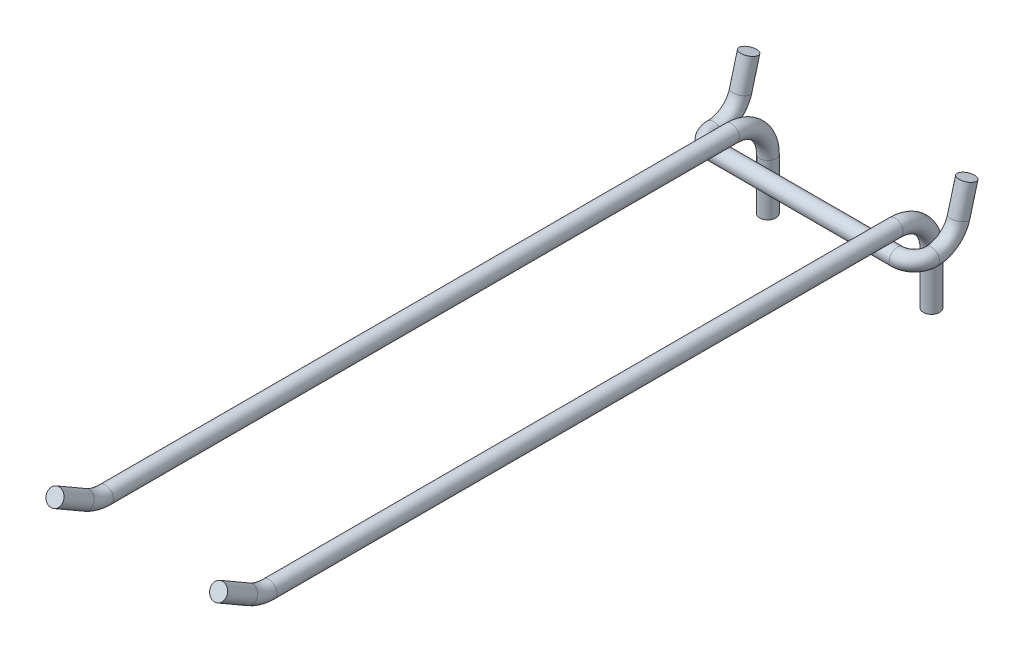
ISO-10303-21;
HEADER;
FILE_DESCRIPTION(('STEP AP214'),'2;1');
FILE_NAME('part.step','',(''),(''),'','','');
FILE_SCHEMA(('AUTOMOTIVE_DESIGN { 1 0 10303 214 1 1 1 1 }'));
ENDSEC;
DATA;
#1=APPLICATION_CONTEXT('core data for automotive mechanical design processes');
#2=APPLICATION_PROTOCOL_DEFINITION('international standard','automotive_design',2000,#1);
#3=PRODUCT_CONTEXT('',#1,'mechanical');
#4=PRODUCT('Part','Part','',(#3));
#5=PRODUCT_RELATED_PRODUCT_CATEGORY('part','',(#4));
#6=PRODUCT_DEFINITION_FORMATION('','',#4);
#7=PRODUCT_DEFINITION_CONTEXT('part definition',#1,'design');
#8=PRODUCT_DEFINITION('design','',#6,#7);
#9=PRODUCT_DEFINITION_SHAPE('','',#8);
#10=(LENGTH_UNIT() NAMED_UNIT(*) SI_UNIT(.MILLI.,.METRE.));
#11=(NAMED_UNIT(*) PLANE_ANGLE_UNIT() SI_UNIT($,.RADIAN.));
#12=(NAMED_UNIT(*) SI_UNIT($,.STERADIAN.) SOLID_ANGLE_UNIT());
#13=UNCERTAINTY_MEASURE_WITH_UNIT(LENGTH_MEASURE(1.E-05),#10,'distance_accuracy_value','');
#14=(GEOMETRIC_REPRESENTATION_CONTEXT(3) GLOBAL_UNCERTAINTY_ASSIGNED_CONTEXT((#13)) GLOBAL_UNIT_ASSIGNED_CONTEXT((#10,
#11,#12)) REPRESENTATION_CONTEXT('',''));
#15=CARTESIAN_POINT('',(0.,0.,0.));
#16=DIRECTION('',(0.,0.,1.));
#17=DIRECTION('',(1.,0.,0.));
#18=AXIS2_PLACEMENT_3D('',#15,#16,#17);
#19=CARTESIAN_POINT('',(19.05,-18.57375,-81.3689));
#20=DIRECTION('',(0.,-1.,0.));
#21=DIRECTION('',(0.,0.,-1.));
#22=AXIS2_PLACEMENT_3D('',#19,#20,#21);
#23=PLANE('',#22);
#24=CARTESIAN_POINT('',(19.05,-18.57375,-81.3689));
#25=DIRECTION('',(0.,1.,0.));
#26=DIRECTION('',(0.,0.,-1.));
#27=AXIS2_PLACEMENT_3D('',#24,#25,#26);
#28=CIRCLE('',#27,1.8796);
#29=CARTESIAN_POINT('',(19.05,-18.57375,-83.2485));
#30=VERTEX_POINT('',#29);
#31=EDGE_CURVE('E77',#30,#30,#28,.T.);
#32=ORIENTED_EDGE('',*,*,#31,.F.);
#33=EDGE_LOOP('',(#32));
#34=FACE_BOUND('',#33,.T.);
#35=ADVANCED_FACE('F65',(#34),#23,.T.);
#36=CARTESIAN_POINT('',(19.05,7.19976140133623,84.6709));
#37=DIRECTION('',(0.,-0.499999999999993,-0.866025403784443));
#38=DIRECTION('',(0.,0.866025403784443,-0.499999999999993));
#39=AXIS2_PLACEMENT_3D('',#36,#37,#38);
#40=PLANE('',#39);
#41=CARTESIAN_POINT('',(19.05,7.19976140133623,84.6709));
#42=DIRECTION('',(0.,0.499999999999993,0.866025403784443));
#43=DIRECTION('',(0.,0.866025403784443,-0.499999999999993));
#44=AXIS2_PLACEMENT_3D('',#41,#42,#43);
#45=CIRCLE('',#44,1.8796);
#46=CARTESIAN_POINT('',(19.05,8.82754275028947,83.7311));
#47=VERTEX_POINT('',#46);
#48=EDGE_CURVE('E13',#47,#47,#45,.T.);
#49=ORIENTED_EDGE('',*,*,#48,.T.);
#50=EDGE_LOOP('',(#49));
#51=FACE_BOUND('',#50,.T.);
#52=ADVANCED_FACE('F80',(#51),#40,.F.);
#53=CARTESIAN_POINT('',(19.05,-18.57375,-81.3689));
#54=DIRECTION('',(0.,1.,0.));
#55=DIRECTION('',(0.,0.,1.));
#56=AXIS2_PLACEMENT_3D('',#53,#54,#55);
#57=CYLINDRICAL_SURFACE('',#56,1.8796);
#58=CARTESIAN_POINT('',(19.05,-6.5786,-81.3689));
#59=DIRECTION('',(0.,1.,0.));
#60=DIRECTION('',(0.,0.,-1.));
#61=AXIS2_PLACEMENT_3D('',#58,#59,#60);
#62=CIRCLE('',#61,1.8796);
#63=CARTESIAN_POINT('',(19.05,-6.5786,-83.2485));
#64=VERTEX_POINT('',#63);
#65=EDGE_CURVE('E97',#64,#64,#62,.T.);
#66=ORIENTED_EDGE('',*,*,#65,.F.);
#67=EDGE_LOOP('',(#66));
#68=FACE_BOUND('',#67,.T.);
#69=ORIENTED_EDGE('',*,*,#31,.T.);
#70=EDGE_LOOP('',(#69));
#71=FACE_BOUND('',#70,.T.);
#72=ADVANCED_FACE('F104',(#68,#71),#57,.T.);
#73=CARTESIAN_POINT('',(19.05,-6.5786,-72.9107));
#74=DIRECTION('',(-1.,0.,0.));
#75=DIRECTION('',(0.,0.,-1.));
#76=AXIS2_PLACEMENT_3D('',#73,#74,#75);
#77=TOROIDAL_SURFACE('',#76,8.45819999999999,1.8796);
#78=CARTESIAN_POINT('',(19.05,1.87960000000001,-72.9107));
#79=DIRECTION('',(0.,0.,1.));
#80=DIRECTION('',(0.,1.,0.));
#81=AXIS2_PLACEMENT_3D('',#78,#79,#80);
#82=CIRCLE('',#81,1.8796);
#83=CARTESIAN_POINT('',(19.05,3.75919999999999,-72.9107));
#84=VERTEX_POINT('',#83);
#85=EDGE_CURVE('E92',#84,#84,#82,.T.);
#86=CARTESIAN_POINT('',(19.05,-6.5786,-72.9107));
#87=DIRECTION('',(-1.,0.,0.));
#88=DIRECTION('',(0.,0.,-1.));
#89=AXIS2_PLACEMENT_3D('',#86,#87,#88);
#90=CIRCLE('',#89,10.3378);
#91=EDGE_CURVE('',#84,#64,#90,.T.);
#92=ORIENTED_EDGE('',*,*,#85,.F.);
#93=ORIENTED_EDGE('',*,*,#65,.T.);
#94=ORIENTED_EDGE('',*,*,#91,.T.);
#95=ORIENTED_EDGE('',*,*,#91,.F.);
#96=EDGE_LOOP('',(#92,#94,#93,#95));
#97=FACE_BOUND('',#96,.T.);
#98=ADVANCED_FACE('F102',(#97),#77,.T.);
#99=CARTESIAN_POINT('',(19.05,1.87960000000001,-72.9107));
#100=DIRECTION('',(0.,0.,1.));
#101=DIRECTION('',(0.,-1.,0.));
#102=AXIS2_PLACEMENT_3D('',#99,#100,#101);
#103=CYLINDRICAL_SURFACE('',#102,1.8796);
#104=CARTESIAN_POINT('',(19.05,1.8796,72.9107));
#105=DIRECTION('',(0.,0.,1.));
#106=DIRECTION('',(0.,1.,0.));
#107=AXIS2_PLACEMENT_3D('',#104,#105,#106);
#108=CIRCLE('',#107,1.8796);
#109=CARTESIAN_POINT('',(19.05,0.,72.9107));
#110=VERTEX_POINT('',#109);
#111=EDGE_CURVE('E90',#110,#110,#108,.T.);
#112=ORIENTED_EDGE('',*,*,#111,.F.);
#113=EDGE_LOOP('',(#112));
#114=FACE_BOUND('',#113,.T.);
#115=ORIENTED_EDGE('',*,*,#85,.T.);
#116=EDGE_LOOP('',(#115));
#117=FACE_BOUND('',#116,.T.);
#118=ADVANCED_FACE('F111',(#114,#117),#103,.T.);
#119=CARTESIAN_POINT('',(19.05,11.3792,72.9107));
#120=DIRECTION('',(1.,0.,0.));
#121=DIRECTION('',(0.,0.,1.));
#122=AXIS2_PLACEMENT_3D('',#119,#120,#121);
#123=TOROIDAL_SURFACE('',#122,9.4996,1.8796);
#124=CARTESIAN_POINT('',(19.05,3.15230507420931,77.6605));
#125=DIRECTION('',(0.,0.499999999999994,0.866025403784442));
#126=DIRECTION('',(0.,0.866025403784442,-0.499999999999994));
#127=AXIS2_PLACEMENT_3D('',#124,#125,#126);
#128=CIRCLE('',#127,1.8796);
#129=CARTESIAN_POINT('',(19.05,1.52452372525607,78.6002999999999));
#130=VERTEX_POINT('',#129);
#131=EDGE_CURVE('E72',#130,#130,#128,.T.);
#132=CARTESIAN_POINT('',(19.05,11.3792,72.9107));
#133=DIRECTION('',(1.,0.,0.));
#134=DIRECTION('',(0.,0.,1.));
#135=AXIS2_PLACEMENT_3D('',#132,#133,#134);
#136=CIRCLE('',#135,11.3792);
#137=EDGE_CURVE('',#130,#110,#136,.T.);
#138=ORIENTED_EDGE('',*,*,#131,.F.);
#139=ORIENTED_EDGE('',*,*,#111,.T.);
#140=ORIENTED_EDGE('',*,*,#137,.T.);
#141=ORIENTED_EDGE('',*,*,#137,.F.);
#142=EDGE_LOOP('',(#138,#140,#139,#141));
#143=FACE_BOUND('',#142,.T.);
#144=ADVANCED_FACE('F85',(#143),#123,.T.);
#145=CARTESIAN_POINT('',(19.05,3.15230507420931,77.6605));
#146=DIRECTION('',(0.,0.499999999999995,0.866025403784442));
#147=DIRECTION('',(0.,-0.866025403784442,0.499999999999995));
#148=AXIS2_PLACEMENT_3D('',#145,#146,#147);
#149=CYLINDRICAL_SURFACE('',#148,1.8796);
#150=ORIENTED_EDGE('',*,*,#48,.F.);
#151=EDGE_LOOP('',(#150));
#152=FACE_BOUND('',#151,.T.);
#153=ORIENTED_EDGE('',*,*,#131,.T.);
#154=EDGE_LOOP('',(#153));
#155=FACE_BOUND('',#154,.T.);
#156=ADVANCED_FACE('F82',(#152,#155),#149,.T.);
#157=CLOSED_SHELL('',(#35,#52,#72,#98,#118,#144,#156));
#158=MANIFOLD_SOLID_BREP('B2',#157);
#159=CARTESIAN_POINT('',(-19.05,-18.57375,-81.3689));
#160=DIRECTION('',(0.,-1.,0.));
#161=DIRECTION('',(0.,0.,-1.));
#162=AXIS2_PLACEMENT_3D('',#159,#160,#161);
#163=PLANE('',#162);
#164=CARTESIAN_POINT('',(-19.05,-18.57375,-81.3689));
#165=DIRECTION('',(0.,-1.,0.));
#166=DIRECTION('',(0.,0.,-1.));
#167=AXIS2_PLACEMENT_3D('',#164,#165,#166);
#168=CIRCLE('',#167,1.8796);
#169=CARTESIAN_POINT('',(-19.05,-18.57375,-83.2485));
#170=VERTEX_POINT('',#169);
#171=EDGE_CURVE('E188',#170,#170,#168,.T.);
#172=ORIENTED_EDGE('',*,*,#171,.T.);
#173=EDGE_LOOP('',(#172));
#174=FACE_BOUND('',#173,.T.);
#175=ADVANCED_FACE('F176',(#174),#163,.T.);
#176=CARTESIAN_POINT('',(-19.05,7.19976140133623,84.6709));
#177=DIRECTION('',(0.,-0.499999999999993,-0.866025403784443));
#178=DIRECTION('',(0.,0.866025403784443,-0.499999999999993));
#179=AXIS2_PLACEMENT_3D('',#176,#177,#178);
#180=PLANE('',#179);
#181=CARTESIAN_POINT('',(-19.05,7.19976140133623,84.6709));
#182=DIRECTION('',(0.,-0.499999999999993,-0.866025403784443));
#183=DIRECTION('',(0.,0.866025403784443,-0.499999999999993));
#184=AXIS2_PLACEMENT_3D('',#181,#182,#183);
#185=CIRCLE('',#184,1.8796);
#186=CARTESIAN_POINT('',(-19.05,8.82754275028947,83.7311));
#187=VERTEX_POINT('',#186);
#188=EDGE_CURVE('E63',#187,#187,#185,.T.);
#189=ORIENTED_EDGE('',*,*,#188,.F.);
#190=EDGE_LOOP('',(#189));
#191=FACE_BOUND('',#190,.T.);
#192=ADVANCED_FACE('F194',(#191),#180,.F.);
#193=CARTESIAN_POINT('',(-19.05,-18.57375,-81.3689));
#194=DIRECTION('',(0.,1.,0.));
#195=DIRECTION('',(0.,0.,1.));
#196=AXIS2_PLACEMENT_3D('',#193,#194,#195);
#197=CYLINDRICAL_SURFACE('',#196,1.8796);
#198=CARTESIAN_POINT('',(-19.05,-6.5786,-81.3689));
#199=DIRECTION('',(0.,-1.,0.));
#200=DIRECTION('',(0.,0.,-1.));
#201=AXIS2_PLACEMENT_3D('',#198,#199,#200);
#202=CIRCLE('',#201,1.8796);
#203=CARTESIAN_POINT('',(-19.05,-6.5786,-83.2485));
#204=VERTEX_POINT('',#203);
#205=EDGE_CURVE('E228',#204,#204,#202,.T.);
#206=ORIENTED_EDGE('',*,*,#205,.T.);
#207=EDGE_LOOP('',(#206));
#208=FACE_BOUND('',#207,.T.);
#209=ORIENTED_EDGE('',*,*,#171,.F.);
#210=EDGE_LOOP('',(#209));
#211=FACE_BOUND('',#210,.T.);
#212=ADVANCED_FACE('F196',(#208,#211),#197,.T.);
#213=CARTESIAN_POINT('',(-19.05,-6.5786,-72.9107));
#214=DIRECTION('',(1.,0.,0.));
#215=DIRECTION('',(0.,0.,-1.));
#216=AXIS2_PLACEMENT_3D('',#213,#214,#215);
#217=TOROIDAL_SURFACE('',#216,8.45819999999999,1.8796);
#218=CARTESIAN_POINT('',(-19.05,1.87960000000001,-72.9107));
#219=DIRECTION('',(0.,0.,-1.));
#220=DIRECTION('',(0.,1.,0.));
#221=AXIS2_PLACEMENT_3D('',#218,#219,#220);
#222=CIRCLE('',#221,1.8796);
#223=CARTESIAN_POINT('',(-19.05,3.75919999999999,-72.9107));
#224=VERTEX_POINT('',#223);
#225=EDGE_CURVE('E225',#224,#224,#222,.T.);
#226=CARTESIAN_POINT('',(-19.05,-6.5786,-72.9107));
#227=DIRECTION('',(1.,0.,0.));
#228=DIRECTION('',(0.,0.,-1.));
#229=AXIS2_PLACEMENT_3D('',#226,#227,#228);
#230=CIRCLE('',#229,10.3378);
#231=EDGE_CURVE('',#204,#224,#230,.T.);
#232=ORIENTED_EDGE('',*,*,#205,.F.);
#233=ORIENTED_EDGE('',*,*,#225,.T.);
#234=ORIENTED_EDGE('',*,*,#231,.T.);
#235=ORIENTED_EDGE('',*,*,#231,.F.);
#236=EDGE_LOOP('',(#232,#234,#233,#235));
#237=FACE_BOUND('',#236,.T.);
#238=ADVANCED_FACE('F201',(#237),#217,.T.);
#239=CARTESIAN_POINT('',(-19.05,1.87960000000001,-72.9107));
#240=DIRECTION('',(0.,0.,1.));
#241=DIRECTION('',(0.,-1.,0.));
#242=AXIS2_PLACEMENT_3D('',#239,#240,#241);
#243=CYLINDRICAL_SURFACE('',#242,1.8796);
#244=CARTESIAN_POINT('',(-19.05,1.8796,72.9107));
#245=DIRECTION('',(0.,0.,-1.));
#246=DIRECTION('',(0.,1.,0.));
#247=AXIS2_PLACEMENT_3D('',#244,#245,#246);
#248=CIRCLE('',#247,1.8796);
#249=CARTESIAN_POINT('',(-19.05,0.,72.9107));
#250=VERTEX_POINT('',#249);
#251=EDGE_CURVE('E230',#250,#250,#248,.T.);
#252=ORIENTED_EDGE('',*,*,#251,.T.);
#253=EDGE_LOOP('',(#252));
#254=FACE_BOUND('',#253,.T.);
#255=ORIENTED_EDGE('',*,*,#225,.F.);
#256=EDGE_LOOP('',(#255));
#257=FACE_BOUND('',#256,.T.);
#258=ADVANCED_FACE('F211',(#254,#257),#243,.T.);
#259=CARTESIAN_POINT('',(-19.05,11.3792,72.9107));
#260=DIRECTION('',(-1.,0.,0.));
#261=DIRECTION('',(0.,0.,1.));
#262=AXIS2_PLACEMENT_3D('',#259,#260,#261);
#263=TOROIDAL_SURFACE('',#262,9.4996,1.8796);
#264=CARTESIAN_POINT('',(-19.05,3.15230507420931,77.6605));
#265=DIRECTION('',(0.,-0.499999999999994,-0.866025403784442));
#266=DIRECTION('',(0.,0.866025403784442,-0.499999999999994));
#267=AXIS2_PLACEMENT_3D('',#264,#265,#266);
#268=CIRCLE('',#267,1.8796);
#269=CARTESIAN_POINT('',(-19.05,1.52452372525607,78.6002999999999));
#270=VERTEX_POINT('',#269);
#271=EDGE_CURVE('E183',#270,#270,#268,.T.);
#272=CARTESIAN_POINT('',(-19.05,11.3792,72.9107));
#273=DIRECTION('',(-1.,0.,0.));
#274=DIRECTION('',(0.,0.,1.));
#275=AXIS2_PLACEMENT_3D('',#272,#273,#274);
#276=CIRCLE('',#275,11.3792);
#277=EDGE_CURVE('',#250,#270,#276,.T.);
#278=ORIENTED_EDGE('',*,*,#251,.F.);
#279=ORIENTED_EDGE('',*,*,#271,.T.);
#280=ORIENTED_EDGE('',*,*,#277,.T.);
#281=ORIENTED_EDGE('',*,*,#277,.F.);
#282=EDGE_LOOP('',(#278,#280,#279,#281));
#283=FACE_BOUND('',#282,.T.);
#284=ADVANCED_FACE('F207',(#283),#263,.T.);
#285=CARTESIAN_POINT('',(-19.05,3.15230507420931,77.6605));
#286=DIRECTION('',(0.,0.499999999999995,0.866025403784442));
#287=DIRECTION('',(0.,-0.866025403784442,0.499999999999995));
#288=AXIS2_PLACEMENT_3D('',#285,#286,#287);
#289=CYLINDRICAL_SURFACE('',#288,1.8796);
#290=ORIENTED_EDGE('',*,*,#188,.T.);
#291=EDGE_LOOP('',(#290));
#292=FACE_BOUND('',#291,.T.);
#293=ORIENTED_EDGE('',*,*,#271,.F.);
#294=EDGE_LOOP('',(#293));
#295=FACE_BOUND('',#294,.T.);
#296=ADVANCED_FACE('F191',(#292,#295),#289,.T.);
#297=CLOSED_SHELL('',(#175,#192,#212,#238,#258,#284,#296));
#298=MANIFOLD_SOLID_BREP('B7',#297);
#299=CARTESIAN_POINT('',(-25.4,10.00125,-83.2485));
#300=DIRECTION('',(0.,0.965925826289069,-0.25881904510252));
#301=DIRECTION('',(0.,-0.25881904510252,-0.965925826289069));
#302=AXIS2_PLACEMENT_3D('',#299,#300,#301);
#303=PLANE('',#302);
#304=CARTESIAN_POINT('',(-25.4,10.00125,-83.2485));
#305=DIRECTION('',(0.,0.965925826289069,-0.25881904510252));
#306=DIRECTION('',(0.,-0.25881904510252,-0.965925826289069));
#307=AXIS2_PLACEMENT_3D('',#304,#305,#306);
#308=CIRCLE('',#307,1.8796);
#309=CARTESIAN_POINT('',(-25.4,9.51477372282534,-85.064054183093));
#310=VERTEX_POINT('',#309);
#311=EDGE_CURVE('E290',#310,#310,#308,.T.);
#312=ORIENTED_EDGE('',*,*,#311,.T.);
#313=EDGE_LOOP('',(#312));
#314=FACE_BOUND('',#313,.T.);
#315=ADVANCED_FACE('F278',(#314),#303,.T.);
#316=CARTESIAN_POINT('',(25.4,10.00125,-83.2485));
#317=DIRECTION('',(0.,-0.96592582628907,0.258819045102516));
#318=DIRECTION('',(0.,-0.258819045102516,-0.96592582628907));
#319=AXIS2_PLACEMENT_3D('',#316,#317,#318);
#320=PLANE('',#319);
#321=CARTESIAN_POINT('',(25.4,10.00125,-83.2485));
#322=DIRECTION('',(0.,-0.96592582628907,0.258819045102516));
#323=DIRECTION('',(0.,-0.258819045102516,-0.96592582628907));
#324=AXIS2_PLACEMENT_3D('',#321,#322,#323);
#325=CIRCLE('',#324,1.8796);
#326=CARTESIAN_POINT('',(25.4,9.51477372282532,-85.064054183093));
#327=VERTEX_POINT('',#326);
#328=EDGE_CURVE('E174',#327,#327,#325,.T.);
#329=ORIENTED_EDGE('',*,*,#328,.F.);
#330=EDGE_LOOP('',(#329));
#331=FACE_BOUND('',#330,.T.);
#332=ADVANCED_FACE('F296',(#331),#320,.F.);
#333=CARTESIAN_POINT('',(-25.4,10.00125,-83.2485));
#334=DIRECTION('',(0.,-0.965925826289069,0.258819045102518));
#335=DIRECTION('',(0.,-0.258819045102518,-0.965925826289069));
#336=AXIS2_PLACEMENT_3D('',#333,#334,#335);
#337=CYLINDRICAL_SURFACE('',#336,1.8796);
#338=CARTESIAN_POINT('',(-25.4,2.99633302988857,-81.3715381548116));
#339=DIRECTION('',(0.,0.965925826289069,-0.25881904510252));
#340=DIRECTION('',(0.,-0.25881904510252,-0.965925826289069));
#341=AXIS2_PLACEMENT_3D('',#338,#339,#340);
#342=CIRCLE('',#341,1.8796);
#343=CARTESIAN_POINT('',(-25.4,2.50985675271388,-83.1870923379046));
#344=VERTEX_POINT('',#343);
#345=EDGE_CURVE('E338',#344,#344,#342,.T.);
#346=ORIENTED_EDGE('',*,*,#345,.T.);
#347=EDGE_LOOP('',(#346));
#348=FACE_BOUND('',#347,.T.);
#349=ORIENTED_EDGE('',*,*,#311,.F.);
#350=EDGE_LOOP('',(#349));
#351=FACE_BOUND('',#350,.T.);
#352=ADVANCED_FACE('F298',(#348,#351),#337,.T.);
#353=CARTESIAN_POINT('',(-25.4,4.699,-75.0170985139863));
#354=DIRECTION('',(-1.,0.,0.));
#355=DIRECTION('',(0.,0.,1.));
#356=AXIS2_PLACEMENT_3D('',#353,#354,#355);
#357=TOROIDAL_SURFACE('',#356,6.57860000000003,1.8796);
#358=CARTESIAN_POINT('',(-25.4,-1.87960000000002,-75.0170985139863));
#359=DIRECTION('',(0.,0.,-1.));
#360=DIRECTION('',(0.,-1.,0.));
#361=AXIS2_PLACEMENT_3D('',#358,#359,#360);
#362=CIRCLE('',#361,1.8796);
#363=CARTESIAN_POINT('',(-25.4,-3.75920000000003,-75.0170985139863));
#364=VERTEX_POINT('',#363);
#365=EDGE_CURVE('E335',#364,#364,#362,.T.);
#366=CARTESIAN_POINT('',(-25.4,4.699,-75.0170985139863));
#367=DIRECTION('',(-1.,0.,0.));
#368=DIRECTION('',(0.,0.,1.));
#369=AXIS2_PLACEMENT_3D('',#366,#367,#368);
#370=CIRCLE('',#369,8.45820000000003);
#371=EDGE_CURVE('',#344,#364,#370,.T.);
#372=ORIENTED_EDGE('',*,*,#345,.F.);
#373=ORIENTED_EDGE('',*,*,#365,.T.);
#374=ORIENTED_EDGE('',*,*,#371,.T.);
#375=ORIENTED_EDGE('',*,*,#371,.F.);
#376=EDGE_LOOP('',(#372,#374,#373,#375));
#377=FACE_BOUND('',#376,.T.);
#378=ADVANCED_FACE('F303',(#377),#357,.T.);
#379=CARTESIAN_POINT('',(-21.4140014860137,-1.87960000000002,-75.0170985139863));
#380=DIRECTION('',(0.,1.,0.));
#381=DIRECTION('',(0.,0.,1.));
#382=AXIS2_PLACEMENT_3D('',#379,#380,#381);
#383=TOROIDAL_SURFACE('',#382,3.98599851398632,1.8796);
#384=CARTESIAN_POINT('',(-21.4140014860137,-1.87960000000002,-71.0311));
#385=DIRECTION('',(-1.,0.,0.));
#386=DIRECTION('',(0.,-1.,0.));
#387=AXIS2_PLACEMENT_3D('',#384,#385,#386);
#388=CIRCLE('',#387,1.8796);
#389=CARTESIAN_POINT('',(-21.4140014860137,-3.75920000000002,-71.0311));
#390=VERTEX_POINT('',#389);
#391=EDGE_CURVE('E340',#390,#390,#388,.T.);
#392=ORIENTED_EDGE('',*,*,#391,.T.);
#393=EDGE_LOOP('',(#392));
#394=FACE_BOUND('',#393,.T.);
#395=ORIENTED_EDGE('',*,*,#365,.F.);
#396=EDGE_LOOP('',(#395));
#397=FACE_BOUND('',#396,.T.);
#398=ADVANCED_FACE('F323',(#394,#397),#383,.T.);
#399=CARTESIAN_POINT('',(-21.4140014860137,-1.87960000000002,-71.0311));
#400=DIRECTION('',(1.,0.,0.));
#401=DIRECTION('',(0.,0.,-1.));
#402=AXIS2_PLACEMENT_3D('',#399,#400,#401);
#403=CYLINDRICAL_SURFACE('',#402,1.8796);
#404=CARTESIAN_POINT('',(21.4140014860137,-1.87960000000002,-71.0311));
#405=DIRECTION('',(-1.,0.,0.));
#406=DIRECTION('',(0.,-1.,0.));
#407=AXIS2_PLACEMENT_3D('',#404,#405,#406);
#408=CIRCLE('',#407,1.8796);
#409=CARTESIAN_POINT('',(21.4140014860137,-1.87960000000002,-69.1515));
#410=VERTEX_POINT('',#409);
#411=EDGE_CURVE('E346',#410,#410,#408,.T.);
#412=ORIENTED_EDGE('',*,*,#411,.T.);
#413=EDGE_LOOP('',(#412));
#414=FACE_BOUND('',#413,.T.);
#415=ORIENTED_EDGE('',*,*,#391,.F.);
#416=EDGE_LOOP('',(#415));
#417=FACE_BOUND('',#416,.T.);
#418=ADVANCED_FACE('F319',(#414,#417),#403,.T.);
#419=CARTESIAN_POINT('',(21.4140014860137,-1.87960000000002,-75.0170985139863));
#420=DIRECTION('',(0.,1.,0.));
#421=DIRECTION('',(0.,0.,1.));
#422=AXIS2_PLACEMENT_3D('',#419,#420,#421);
#423=TOROIDAL_SURFACE('',#422,3.98599851398632,1.8796);
#424=CARTESIAN_POINT('',(25.4,-1.87960000000002,-75.0170985139863));
#425=DIRECTION('',(0.,0.,1.));
#426=DIRECTION('',(0.,-1.,0.));
#427=AXIS2_PLACEMENT_3D('',#424,#425,#426);
#428=CIRCLE('',#427,1.8796);
#429=CARTESIAN_POINT('',(27.2796,-1.87960000000002,-75.0170985139863));
#430=VERTEX_POINT('',#429);
#431=EDGE_CURVE('E349',#430,#430,#428,.T.);
#432=CARTESIAN_POINT('',(21.4140014860137,-1.87960000000002,-75.0170985139863));
#433=DIRECTION('',(0.,1.,0.));
#434=DIRECTION('',(0.,0.,1.));
#435=AXIS2_PLACEMENT_3D('',#432,#433,#434);
#436=CIRCLE('',#435,5.86559851398632);
#437=EDGE_CURVE('',#410,#430,#436,.T.);
#438=ORIENTED_EDGE('',*,*,#411,.F.);
#439=ORIENTED_EDGE('',*,*,#431,.T.);
#440=ORIENTED_EDGE('',*,*,#437,.T.);
#441=ORIENTED_EDGE('',*,*,#437,.F.);
#442=EDGE_LOOP('',(#438,#440,#439,#441));
#443=FACE_BOUND('',#442,.T.);
#444=ADVANCED_FACE('F313',(#443),#423,.T.);
#445=CARTESIAN_POINT('',(25.4,4.699,-75.0170985139863));
#446=DIRECTION('',(1.,0.,0.));
#447=DIRECTION('',(0.,0.,-1.));
#448=AXIS2_PLACEMENT_3D('',#445,#446,#447);
#449=TOROIDAL_SURFACE('',#448,6.57860000000002,1.8796);
#450=CARTESIAN_POINT('',(25.4,2.99633302988857,-81.3715381548116));
#451=DIRECTION('',(0.,-0.96592582628907,0.258819045102516));
#452=DIRECTION('',(0.,-0.258819045102516,-0.96592582628907));
#453=AXIS2_PLACEMENT_3D('',#450,#451,#452);
#454=CIRCLE('',#453,1.8796);
#455=CARTESIAN_POINT('',(25.4,2.50985675271389,-83.1870923379046));
#456=VERTEX_POINT('',#455);
#457=EDGE_CURVE('E285',#456,#456,#454,.T.);
#458=ORIENTED_EDGE('',*,*,#457,.T.);
#459=EDGE_LOOP('',(#458));
#460=FACE_BOUND('',#459,.T.);
#461=ORIENTED_EDGE('',*,*,#431,.F.);
#462=EDGE_LOOP('',(#461));
#463=FACE_BOUND('',#462,.T.);
#464=ADVANCED_FACE('F309',(#460,#463),#449,.T.);
#465=CARTESIAN_POINT('',(25.4,2.99633302988857,-81.3715381548116));
#466=DIRECTION('',(0.,0.965925826289069,-0.258819045102518));
#467=DIRECTION('',(0.,0.258819045102518,0.965925826289069));
#468=AXIS2_PLACEMENT_3D('',#465,#466,#467);
#469=CYLINDRICAL_SURFACE('',#468,1.8796);
#470=ORIENTED_EDGE('',*,*,#328,.T.);
#471=EDGE_LOOP('',(#470));
#472=FACE_BOUND('',#471,.T.);
#473=ORIENTED_EDGE('',*,*,#457,.F.);
#474=EDGE_LOOP('',(#473));
#475=FACE_BOUND('',#474,.T.);
#476=ADVANCED_FACE('F293',(#472,#475),#469,.T.);
#477=CLOSED_SHELL('',(#315,#332,#352,#378,#398,#418,#444,#464,#476));
#478=MANIFOLD_SOLID_BREP('B57',#477);
#479=ADVANCED_BREP_SHAPE_REPRESENTATION('',(#18,#158,#298,#478),#14);
#480=SHAPE_DEFINITION_REPRESENTATION(#9,#479);
ENDSEC;
END-ISO-10303-21;
